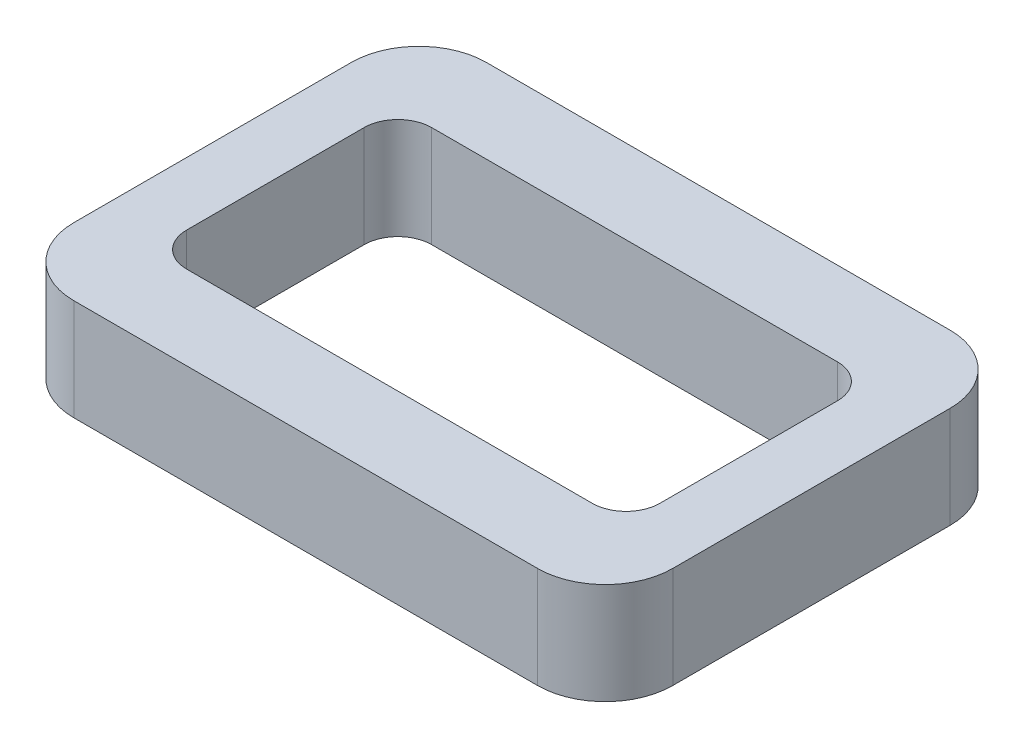
ISO-10303-21;
HEADER;
FILE_DESCRIPTION(('STEP AP214'),'2;1');
FILE_NAME('part.step','',(''),(''),'','','');
FILE_SCHEMA(('AUTOMOTIVE_DESIGN { 1 0 10303 214 1 1 1 1 }'));
ENDSEC;
DATA;
#1=APPLICATION_CONTEXT('core data for automotive mechanical design processes');
#2=APPLICATION_PROTOCOL_DEFINITION('international standard','automotive_design',2000,#1);
#3=PRODUCT_CONTEXT('',#1,'mechanical');
#4=PRODUCT('Part','Part','',(#3));
#5=PRODUCT_RELATED_PRODUCT_CATEGORY('part','',(#4));
#6=PRODUCT_DEFINITION_FORMATION('','',#4);
#7=PRODUCT_DEFINITION_CONTEXT('part definition',#1,'design');
#8=PRODUCT_DEFINITION('design','',#6,#7);
#9=PRODUCT_DEFINITION_SHAPE('','',#8);
#10=(LENGTH_UNIT() NAMED_UNIT(*) SI_UNIT(.MILLI.,.METRE.));
#11=(NAMED_UNIT(*) PLANE_ANGLE_UNIT() SI_UNIT($,.RADIAN.));
#12=(NAMED_UNIT(*) SI_UNIT($,.STERADIAN.) SOLID_ANGLE_UNIT());
#13=UNCERTAINTY_MEASURE_WITH_UNIT(LENGTH_MEASURE(1.E-05),#10,'distance_accuracy_value','');
#14=(GEOMETRIC_REPRESENTATION_CONTEXT(3) GLOBAL_UNCERTAINTY_ASSIGNED_CONTEXT((#13)) GLOBAL_UNIT_ASSIGNED_CONTEXT((#10,
#11,#12)) REPRESENTATION_CONTEXT('',''));
#15=CARTESIAN_POINT('',(0.,0.,0.));
#16=DIRECTION('',(0.,0.,1.));
#17=DIRECTION('',(1.,0.,0.));
#18=AXIS2_PLACEMENT_3D('',#15,#16,#17);
#19=CARTESIAN_POINT('',(81.8747524998957,15.24,21.3119442239792));
#20=DIRECTION('',(0.,-1.,0.));
#21=DIRECTION('',(0.,0.,-1.));
#22=AXIS2_PLACEMENT_3D('',#19,#20,#21);
#23=PLANE('',#22);
#24=DIRECTION('',(0.,0.,1.));
#25=VECTOR('',#24,1.);
#26=CARTESIAN_POINT('',(92.0347524998957,15.24,-20.3680557760208));
#27=LINE('',#26,#25);
#28=CARTESIAN_POINT('',(92.0347524998957,15.24,-20.3680557760208));
#29=VERTEX_POINT('',#28);
#30=CARTESIAN_POINT('',(92.0347524998957,15.24,21.3119442239792));
#31=VERTEX_POINT('',#30);
#32=EDGE_CURVE('E268',#29,#31,#27,.T.);
#33=ORIENTED_EDGE('',*,*,#32,.F.);
#34=CARTESIAN_POINT('',(81.8747524998957,15.24,-20.3680557760208));
#35=DIRECTION('',(0.,1.,0.));
#36=DIRECTION('',(0.,0.,1.));
#37=AXIS2_PLACEMENT_3D('',#34,#35,#36);
#38=CIRCLE('',#37,10.16);
#39=CARTESIAN_POINT('',(81.8747524998957,15.24,-30.5280557760208));
#40=VERTEX_POINT('',#39);
#41=EDGE_CURVE('E288',#29,#40,#38,.T.);
#42=ORIENTED_EDGE('',*,*,#41,.T.);
#43=DIRECTION('',(-1.,0.,0.));
#44=VECTOR('',#43,1.);
#45=CARTESIAN_POINT('',(81.8747524998957,15.24,-30.5280557760208));
#46=LINE('',#45,#44);
#47=CARTESIAN_POINT('',(12.1947524998957,15.24,-30.5280557760207));
#48=VERTEX_POINT('',#47);
#49=EDGE_CURVE('E286',#40,#48,#46,.T.);
#50=ORIENTED_EDGE('',*,*,#49,.T.);
#51=CARTESIAN_POINT('',(12.1947524998957,15.24,-20.3680557760207));
#52=DIRECTION('',(0.,-1.,0.));
#53=DIRECTION('',(0.,0.,-1.));
#54=AXIS2_PLACEMENT_3D('',#51,#52,#53);
#55=CIRCLE('',#54,10.16);
#56=CARTESIAN_POINT('',(2.03475249989574,15.24,-20.3680557760207));
#57=VERTEX_POINT('',#56);
#58=EDGE_CURVE('E283',#57,#48,#55,.T.);
#59=ORIENTED_EDGE('',*,*,#58,.F.);
#60=DIRECTION('',(0.,0.,1.));
#61=VECTOR('',#60,1.);
#62=CARTESIAN_POINT('',(2.03475249989574,15.24,-20.3680557760207));
#63=LINE('',#62,#61);
#64=CARTESIAN_POINT('',(2.03475249989575,15.24,21.3119442239793));
#65=VERTEX_POINT('',#64);
#66=EDGE_CURVE('E281',#57,#65,#63,.T.);
#67=ORIENTED_EDGE('',*,*,#66,.T.);
#68=CARTESIAN_POINT('',(12.1947524998957,15.24,21.3119442239793));
#69=DIRECTION('',(0.,-1.,0.));
#70=DIRECTION('',(0.,0.,-1.));
#71=AXIS2_PLACEMENT_3D('',#68,#69,#70);
#72=CIRCLE('',#71,10.16);
#73=CARTESIAN_POINT('',(12.1947524998957,15.24,31.4719442239793));
#74=VERTEX_POINT('',#73);
#75=EDGE_CURVE('E278',#74,#65,#72,.T.);
#76=ORIENTED_EDGE('',*,*,#75,.F.);
#77=DIRECTION('',(-1.,0.,0.));
#78=VECTOR('',#77,1.);
#79=CARTESIAN_POINT('',(81.8747524998957,15.24,31.4719442239792));
#80=LINE('',#79,#78);
#81=CARTESIAN_POINT('',(81.8747524998957,15.24,31.4719442239792));
#82=VERTEX_POINT('',#81);
#83=EDGE_CURVE('E275',#82,#74,#80,.T.);
#84=ORIENTED_EDGE('',*,*,#83,.F.);
#85=CARTESIAN_POINT('',(81.8747524998957,15.24,21.3119442239792));
#86=DIRECTION('',(0.,-1.,0.));
#87=DIRECTION('',(0.,0.,-1.));
#88=AXIS2_PLACEMENT_3D('',#85,#86,#87);
#89=CIRCLE('',#88,10.16);
#90=EDGE_CURVE('E271',#31,#82,#89,.T.);
#91=ORIENTED_EDGE('',*,*,#90,.F.);
#92=EDGE_LOOP('',(#33,#42,#50,#59,#67,#76,#84,#91));
#93=FACE_BOUND('',#92,.T.);
#94=DIRECTION('',(0.,0.,1.));
#95=VECTOR('',#94,1.);
#96=CARTESIAN_POINT('',(11.4747524998958,15.24,-12.8630557760207));
#97=LINE('',#96,#95);
#98=CARTESIAN_POINT('',(11.4747524998958,15.24,-12.8630557760207));
#99=VERTEX_POINT('',#98);
#100=CARTESIAN_POINT('',(11.4747524998958,15.24,13.8069442239792));
#101=VERTEX_POINT('',#100);
#102=EDGE_CURVE('E199',#99,#101,#97,.T.);
#103=ORIENTED_EDGE('',*,*,#102,.F.);
#104=CARTESIAN_POINT('',(16.5547524998958,15.24,-12.8630557760208));
#105=DIRECTION('',(0.,-1.,0.));
#106=DIRECTION('',(0.,0.,-1.));
#107=AXIS2_PLACEMENT_3D('',#104,#105,#106);
#108=CIRCLE('',#107,5.08);
#109=CARTESIAN_POINT('',(16.5547524998958,15.24,-17.9430557760208));
#110=VERTEX_POINT('',#109);
#111=EDGE_CURVE('E235',#99,#110,#108,.T.);
#112=ORIENTED_EDGE('',*,*,#111,.T.);
#113=DIRECTION('',(1.,0.,0.));
#114=VECTOR('',#113,1.);
#115=CARTESIAN_POINT('',(16.5547524998958,15.24,-17.9430557760208));
#116=LINE('',#115,#114);
#117=CARTESIAN_POINT('',(77.5147524998957,15.24,-17.9430557760208));
#118=VERTEX_POINT('',#117);
#119=EDGE_CURVE('E104',#110,#118,#116,.T.);
#120=ORIENTED_EDGE('',*,*,#119,.T.);
#121=CARTESIAN_POINT('',(77.5147524998957,15.24,-12.8630557760208));
#122=DIRECTION('',(0.,-1.,0.));
#123=DIRECTION('',(0.,0.,-1.));
#124=AXIS2_PLACEMENT_3D('',#121,#122,#123);
#125=CIRCLE('',#124,5.08);
#126=CARTESIAN_POINT('',(82.5947524998957,15.24,-12.8630557760207));
#127=VERTEX_POINT('',#126);
#128=EDGE_CURVE('E231',#118,#127,#125,.T.);
#129=ORIENTED_EDGE('',*,*,#128,.T.);
#130=DIRECTION('',(0.,0.,1.));
#131=VECTOR('',#130,1.);
#132=CARTESIAN_POINT('',(82.5947524998957,15.24,-12.8630557760207));
#133=LINE('',#132,#131);
#134=CARTESIAN_POINT('',(82.5947524998958,15.24,13.8069442239792));
#135=VERTEX_POINT('',#134);
#136=EDGE_CURVE('E228',#127,#135,#133,.T.);
#137=ORIENTED_EDGE('',*,*,#136,.T.);
#138=CARTESIAN_POINT('',(77.5147524998957,15.24,13.8069442239792));
#139=DIRECTION('',(0.,-1.,0.));
#140=DIRECTION('',(0.,0.,-1.));
#141=AXIS2_PLACEMENT_3D('',#138,#139,#140);
#142=CIRCLE('',#141,5.08);
#143=CARTESIAN_POINT('',(77.5147524998957,15.24,18.8869442239792));
#144=VERTEX_POINT('',#143);
#145=EDGE_CURVE('E224',#135,#144,#142,.T.);
#146=ORIENTED_EDGE('',*,*,#145,.T.);
#147=DIRECTION('',(1.,0.,0.));
#148=VECTOR('',#147,1.);
#149=CARTESIAN_POINT('',(16.5547524998958,15.24,18.8869442239792));
#150=LINE('',#149,#148);
#151=CARTESIAN_POINT('',(16.5547524998958,15.24,18.8869442239792));
#152=VERTEX_POINT('',#151);
#153=EDGE_CURVE('E222',#152,#144,#150,.T.);
#154=ORIENTED_EDGE('',*,*,#153,.F.);
#155=CARTESIAN_POINT('',(16.5547524998958,15.24,13.8069442239792));
#156=DIRECTION('',(0.,-1.,0.));
#157=DIRECTION('',(0.,0.,-1.));
#158=AXIS2_PLACEMENT_3D('',#155,#156,#157);
#159=CIRCLE('',#158,5.08);
#160=EDGE_CURVE('E209',#152,#101,#159,.T.);
#161=ORIENTED_EDGE('',*,*,#160,.T.);
#162=EDGE_LOOP('',(#103,#112,#120,#129,#137,#146,#154,#161));
#163=FACE_BOUND('',#162,.T.);
#164=ADVANCED_FACE('F87',(#93,#163),#23,.F.);
#165=CARTESIAN_POINT('',(81.8747524998957,0.,21.3119442239792));
#166=DIRECTION('',(0.,-1.,0.));
#167=DIRECTION('',(0.,0.,-1.));
#168=AXIS2_PLACEMENT_3D('',#165,#166,#167);
#169=PLANE('',#168);
#170=DIRECTION('',(0.,0.,1.));
#171=VECTOR('',#170,1.);
#172=CARTESIAN_POINT('',(92.0347524998957,0.,-20.3680557760208));
#173=LINE('',#172,#171);
#174=CARTESIAN_POINT('',(92.0347524998957,0.,-20.3680557760208));
#175=VERTEX_POINT('',#174);
#176=CARTESIAN_POINT('',(92.0347524998957,0.,21.3119442239792));
#177=VERTEX_POINT('',#176);
#178=EDGE_CURVE('E218',#175,#177,#173,.T.);
#179=ORIENTED_EDGE('',*,*,#178,.T.);
#180=CARTESIAN_POINT('',(81.8747524998957,0.,21.3119442239792));
#181=DIRECTION('',(0.,-1.,0.));
#182=DIRECTION('',(0.,0.,-1.));
#183=AXIS2_PLACEMENT_3D('',#180,#181,#182);
#184=CIRCLE('',#183,10.16);
#185=CARTESIAN_POINT('',(81.8747524998957,0.,31.4719442239792));
#186=VERTEX_POINT('',#185);
#187=EDGE_CURVE('E292',#177,#186,#184,.T.);
#188=ORIENTED_EDGE('',*,*,#187,.T.);
#189=DIRECTION('',(-1.,0.,0.));
#190=VECTOR('',#189,1.);
#191=CARTESIAN_POINT('',(81.8747524998957,0.,31.4719442239792));
#192=LINE('',#191,#190);
#193=CARTESIAN_POINT('',(12.1947524998957,0.,31.4719442239793));
#194=VERTEX_POINT('',#193);
#195=EDGE_CURVE('E295',#186,#194,#192,.T.);
#196=ORIENTED_EDGE('',*,*,#195,.T.);
#197=CARTESIAN_POINT('',(12.1947524998957,0.,21.3119442239793));
#198=DIRECTION('',(0.,-1.,0.));
#199=DIRECTION('',(0.,0.,-1.));
#200=AXIS2_PLACEMENT_3D('',#197,#198,#199);
#201=CIRCLE('',#200,10.16);
#202=CARTESIAN_POINT('',(2.03475249989575,0.,21.3119442239793));
#203=VERTEX_POINT('',#202);
#204=EDGE_CURVE('E298',#194,#203,#201,.T.);
#205=ORIENTED_EDGE('',*,*,#204,.T.);
#206=DIRECTION('',(0.,0.,1.));
#207=VECTOR('',#206,1.);
#208=CARTESIAN_POINT('',(2.03475249989574,0.,-20.3680557760207));
#209=LINE('',#208,#207);
#210=CARTESIAN_POINT('',(2.03475249989574,0.,-20.3680557760207));
#211=VERTEX_POINT('',#210);
#212=EDGE_CURVE('E301',#211,#203,#209,.T.);
#213=ORIENTED_EDGE('',*,*,#212,.F.);
#214=CARTESIAN_POINT('',(12.1947524998957,0.,-20.3680557760207));
#215=DIRECTION('',(0.,-1.,0.));
#216=DIRECTION('',(0.,0.,-1.));
#217=AXIS2_PLACEMENT_3D('',#214,#215,#216);
#218=CIRCLE('',#217,10.16);
#219=CARTESIAN_POINT('',(12.1947524998957,0.,-30.5280557760207));
#220=VERTEX_POINT('',#219);
#221=EDGE_CURVE('E304',#211,#220,#218,.T.);
#222=ORIENTED_EDGE('',*,*,#221,.T.);
#223=DIRECTION('',(-1.,0.,0.));
#224=VECTOR('',#223,1.);
#225=CARTESIAN_POINT('',(81.8747524998957,0.,-30.5280557760208));
#226=LINE('',#225,#224);
#227=CARTESIAN_POINT('',(81.8747524998957,0.,-30.5280557760208));
#228=VERTEX_POINT('',#227);
#229=EDGE_CURVE('E307',#228,#220,#226,.T.);
#230=ORIENTED_EDGE('',*,*,#229,.F.);
#231=CARTESIAN_POINT('',(81.8747524998957,0.,-20.3680557760208));
#232=DIRECTION('',(0.,1.,0.));
#233=DIRECTION('',(0.,0.,1.));
#234=AXIS2_PLACEMENT_3D('',#231,#232,#233);
#235=CIRCLE('',#234,10.16);
#236=EDGE_CURVE('E272',#175,#228,#235,.T.);
#237=ORIENTED_EDGE('',*,*,#236,.F.);
#238=EDGE_LOOP('',(#179,#188,#196,#205,#213,#222,#230,#237));
#239=FACE_BOUND('',#238,.T.);
#240=CARTESIAN_POINT('',(16.5547524998958,0.,-12.8630557760208));
#241=DIRECTION('',(0.,-1.,0.));
#242=DIRECTION('',(0.,0.,-1.));
#243=AXIS2_PLACEMENT_3D('',#240,#241,#242);
#244=CIRCLE('',#243,5.08);
#245=CARTESIAN_POINT('',(11.4747524998958,0.,-12.8630557760207));
#246=VERTEX_POINT('',#245);
#247=CARTESIAN_POINT('',(16.5547524998958,0.,-17.9430557760208));
#248=VERTEX_POINT('',#247);
#249=EDGE_CURVE('E210',#246,#248,#244,.T.);
#250=ORIENTED_EDGE('',*,*,#249,.F.);
#251=DIRECTION('',(0.,0.,1.));
#252=VECTOR('',#251,1.);
#253=CARTESIAN_POINT('',(11.4747524998958,0.,-12.8630557760207));
#254=LINE('',#253,#252);
#255=CARTESIAN_POINT('',(11.4747524998958,0.,13.8069442239792));
#256=VERTEX_POINT('',#255);
#257=EDGE_CURVE('E112',#246,#256,#254,.T.);
#258=ORIENTED_EDGE('',*,*,#257,.T.);
#259=CARTESIAN_POINT('',(16.5547524998958,0.,13.8069442239792));
#260=DIRECTION('',(0.,-1.,0.));
#261=DIRECTION('',(0.,0.,-1.));
#262=AXIS2_PLACEMENT_3D('',#259,#260,#261);
#263=CIRCLE('',#262,5.08);
#264=CARTESIAN_POINT('',(16.5547524998958,0.,18.8869442239792));
#265=VERTEX_POINT('',#264);
#266=EDGE_CURVE('E217',#265,#256,#263,.T.);
#267=ORIENTED_EDGE('',*,*,#266,.F.);
#268=DIRECTION('',(1.,0.,0.));
#269=VECTOR('',#268,1.);
#270=CARTESIAN_POINT('',(16.5547524998958,0.,18.8869442239792));
#271=LINE('',#270,#269);
#272=CARTESIAN_POINT('',(77.5147524998957,0.,18.8869442239792));
#273=VERTEX_POINT('',#272);
#274=EDGE_CURVE('E239',#265,#273,#271,.T.);
#275=ORIENTED_EDGE('',*,*,#274,.T.);
#276=CARTESIAN_POINT('',(77.5147524998957,0.,13.8069442239792));
#277=DIRECTION('',(0.,-1.,0.));
#278=DIRECTION('',(0.,0.,-1.));
#279=AXIS2_PLACEMENT_3D('',#276,#277,#278);
#280=CIRCLE('',#279,5.08);
#281=CARTESIAN_POINT('',(82.5947524998958,0.,13.8069442239792));
#282=VERTEX_POINT('',#281);
#283=EDGE_CURVE('E242',#282,#273,#280,.T.);
#284=ORIENTED_EDGE('',*,*,#283,.F.);
#285=DIRECTION('',(0.,0.,1.));
#286=VECTOR('',#285,1.);
#287=CARTESIAN_POINT('',(82.5947524998957,0.,-12.8630557760207));
#288=LINE('',#287,#286);
#289=CARTESIAN_POINT('',(82.5947524998957,0.,-12.8630557760207));
#290=VERTEX_POINT('',#289);
#291=EDGE_CURVE('E245',#290,#282,#288,.T.);
#292=ORIENTED_EDGE('',*,*,#291,.F.);
#293=CARTESIAN_POINT('',(77.5147524998957,0.,-12.8630557760208));
#294=DIRECTION('',(0.,-1.,0.));
#295=DIRECTION('',(0.,0.,-1.));
#296=AXIS2_PLACEMENT_3D('',#293,#294,#295);
#297=CIRCLE('',#296,5.08);
#298=CARTESIAN_POINT('',(77.5147524998957,0.,-17.9430557760208));
#299=VERTEX_POINT('',#298);
#300=EDGE_CURVE('E248',#299,#290,#297,.T.);
#301=ORIENTED_EDGE('',*,*,#300,.F.);
#302=DIRECTION('',(1.,0.,0.));
#303=VECTOR('',#302,1.);
#304=CARTESIAN_POINT('',(16.5547524998958,0.,-17.9430557760208));
#305=LINE('',#304,#303);
#306=EDGE_CURVE('E251',#248,#299,#305,.T.);
#307=ORIENTED_EDGE('',*,*,#306,.F.);
#308=EDGE_LOOP('',(#250,#258,#267,#275,#284,#292,#301,#307));
#309=FACE_BOUND('',#308,.T.);
#310=ADVANCED_FACE('F331',(#239,#309),#169,.T.);
#311=CARTESIAN_POINT('',(92.0347524998957,15.24,-20.3680557760208));
#312=DIRECTION('',(1.,0.,0.));
#313=DIRECTION('',(0.,0.,-1.));
#314=AXIS2_PLACEMENT_3D('',#311,#312,#313);
#315=PLANE('',#314);
#316=ORIENTED_EDGE('',*,*,#178,.F.);
#317=DIRECTION('',(0.,-1.,0.));
#318=VECTOR('',#317,1.);
#319=CARTESIAN_POINT('',(92.0347524998957,15.24,-20.3680557760208));
#320=LINE('',#319,#318);
#321=EDGE_CURVE('E12',#29,#175,#320,.T.);
#322=ORIENTED_EDGE('',*,*,#321,.F.);
#323=ORIENTED_EDGE('',*,*,#32,.T.);
#324=DIRECTION('',(0.,-1.,0.));
#325=VECTOR('',#324,1.);
#326=CARTESIAN_POINT('',(92.0347524998957,15.24,21.3119442239792));
#327=LINE('',#326,#325);
#328=EDGE_CURVE('E91',#31,#177,#327,.T.);
#329=ORIENTED_EDGE('',*,*,#328,.T.);
#330=EDGE_LOOP('',(#316,#322,#323,#329));
#331=FACE_BOUND('',#330,.T.);
#332=ADVANCED_FACE('F89',(#331),#315,.T.);
#333=CARTESIAN_POINT('',(81.8747524998957,15.24,-20.3680557760208));
#334=DIRECTION('',(0.,-1.,0.));
#335=DIRECTION('',(0.,0.,-1.));
#336=AXIS2_PLACEMENT_3D('',#333,#334,#335);
#337=CYLINDRICAL_SURFACE('',#336,10.16);
#338=ORIENTED_EDGE('',*,*,#236,.T.);
#339=DIRECTION('',(0.,-1.,0.));
#340=VECTOR('',#339,1.);
#341=CARTESIAN_POINT('',(81.8747524998957,15.24,-30.5280557760208));
#342=LINE('',#341,#340);
#343=EDGE_CURVE('E96',#40,#228,#342,.T.);
#344=ORIENTED_EDGE('',*,*,#343,.F.);
#345=ORIENTED_EDGE('',*,*,#41,.F.);
#346=ORIENTED_EDGE('',*,*,#321,.T.);
#347=EDGE_LOOP('',(#338,#344,#345,#346));
#348=FACE_BOUND('',#347,.T.);
#349=ADVANCED_FACE('F336',(#348),#337,.T.);
#350=CARTESIAN_POINT('',(81.8747524998957,15.24,-30.5280557760208));
#351=DIRECTION('',(0.,0.,1.));
#352=DIRECTION('',(1.,0.,0.));
#353=AXIS2_PLACEMENT_3D('',#350,#351,#352);
#354=PLANE('',#353);
#355=ORIENTED_EDGE('',*,*,#229,.T.);
#356=DIRECTION('',(0.,-1.,0.));
#357=VECTOR('',#356,1.);
#358=CARTESIAN_POINT('',(12.1947524998957,15.24,-30.5280557760207));
#359=LINE('',#358,#357);
#360=EDGE_CURVE('E313',#48,#220,#359,.T.);
#361=ORIENTED_EDGE('',*,*,#360,.F.);
#362=ORIENTED_EDGE('',*,*,#49,.F.);
#363=ORIENTED_EDGE('',*,*,#343,.T.);
#364=EDGE_LOOP('',(#355,#361,#362,#363));
#365=FACE_BOUND('',#364,.T.);
#366=ADVANCED_FACE('F340',(#365),#354,.F.);
#367=CARTESIAN_POINT('',(12.1947524998957,15.24,-20.3680557760207));
#368=DIRECTION('',(0.,-1.,0.));
#369=DIRECTION('',(0.,0.,-1.));
#370=AXIS2_PLACEMENT_3D('',#367,#368,#369);
#371=CYLINDRICAL_SURFACE('',#370,10.16);
#372=ORIENTED_EDGE('',*,*,#221,.F.);
#373=DIRECTION('',(0.,-1.,0.));
#374=VECTOR('',#373,1.);
#375=CARTESIAN_POINT('',(2.03475249989574,15.24,-20.3680557760207));
#376=LINE('',#375,#374);
#377=EDGE_CURVE('E315',#57,#211,#376,.T.);
#378=ORIENTED_EDGE('',*,*,#377,.F.);
#379=ORIENTED_EDGE('',*,*,#58,.T.);
#380=ORIENTED_EDGE('',*,*,#360,.T.);
#381=EDGE_LOOP('',(#372,#378,#379,#380));
#382=FACE_BOUND('',#381,.T.);
#383=ADVANCED_FACE('F358',(#382),#371,.T.);
#384=CARTESIAN_POINT('',(2.03475249989574,15.24,-20.3680557760207));
#385=DIRECTION('',(1.,0.,0.));
#386=DIRECTION('',(0.,0.,-1.));
#387=AXIS2_PLACEMENT_3D('',#384,#385,#386);
#388=PLANE('',#387);
#389=ORIENTED_EDGE('',*,*,#212,.T.);
#390=DIRECTION('',(0.,-1.,0.));
#391=VECTOR('',#390,1.);
#392=CARTESIAN_POINT('',(2.03475249989575,15.24,21.3119442239793));
#393=LINE('',#392,#391);
#394=EDGE_CURVE('E317',#65,#203,#393,.T.);
#395=ORIENTED_EDGE('',*,*,#394,.F.);
#396=ORIENTED_EDGE('',*,*,#66,.F.);
#397=ORIENTED_EDGE('',*,*,#377,.T.);
#398=EDGE_LOOP('',(#389,#395,#396,#397));
#399=FACE_BOUND('',#398,.T.);
#400=ADVANCED_FACE('F356',(#399),#388,.F.);
#401=CARTESIAN_POINT('',(12.1947524998957,15.24,21.3119442239793));
#402=DIRECTION('',(0.,-1.,0.));
#403=DIRECTION('',(0.,0.,-1.));
#404=AXIS2_PLACEMENT_3D('',#401,#402,#403);
#405=CYLINDRICAL_SURFACE('',#404,10.16);
#406=ORIENTED_EDGE('',*,*,#204,.F.);
#407=DIRECTION('',(0.,-1.,0.));
#408=VECTOR('',#407,1.);
#409=CARTESIAN_POINT('',(12.1947524998957,15.24,31.4719442239793));
#410=LINE('',#409,#408);
#411=EDGE_CURVE('E319',#74,#194,#410,.T.);
#412=ORIENTED_EDGE('',*,*,#411,.F.);
#413=ORIENTED_EDGE('',*,*,#75,.T.);
#414=ORIENTED_EDGE('',*,*,#394,.T.);
#415=EDGE_LOOP('',(#406,#412,#413,#414));
#416=FACE_BOUND('',#415,.T.);
#417=ADVANCED_FACE('F352',(#416),#405,.T.);
#418=CARTESIAN_POINT('',(81.8747524998957,15.24,31.4719442239792));
#419=DIRECTION('',(0.,0.,1.));
#420=DIRECTION('',(1.,0.,0.));
#421=AXIS2_PLACEMENT_3D('',#418,#419,#420);
#422=PLANE('',#421);
#423=ORIENTED_EDGE('',*,*,#195,.F.);
#424=DIRECTION('',(0.,-1.,0.));
#425=VECTOR('',#424,1.);
#426=CARTESIAN_POINT('',(81.8747524998957,15.24,31.4719442239792));
#427=LINE('',#426,#425);
#428=EDGE_CURVE('E320',#82,#186,#427,.T.);
#429=ORIENTED_EDGE('',*,*,#428,.F.);
#430=ORIENTED_EDGE('',*,*,#83,.T.);
#431=ORIENTED_EDGE('',*,*,#411,.T.);
#432=EDGE_LOOP('',(#423,#429,#430,#431));
#433=FACE_BOUND('',#432,.T.);
#434=ADVANCED_FACE('F347',(#433),#422,.T.);
#435=CARTESIAN_POINT('',(81.8747524998957,15.24,21.3119442239792));
#436=DIRECTION('',(0.,-1.,0.));
#437=DIRECTION('',(0.,0.,-1.));
#438=AXIS2_PLACEMENT_3D('',#435,#436,#437);
#439=CYLINDRICAL_SURFACE('',#438,10.16);
#440=ORIENTED_EDGE('',*,*,#187,.F.);
#441=ORIENTED_EDGE('',*,*,#328,.F.);
#442=ORIENTED_EDGE('',*,*,#90,.T.);
#443=ORIENTED_EDGE('',*,*,#428,.T.);
#444=EDGE_LOOP('',(#440,#441,#442,#443));
#445=FACE_BOUND('',#444,.T.);
#446=ADVANCED_FACE('F328',(#445),#439,.T.);
#447=CARTESIAN_POINT('',(11.4747524998958,15.24,-12.8630557760207));
#448=DIRECTION('',(1.,0.,0.));
#449=DIRECTION('',(0.,0.,-1.));
#450=AXIS2_PLACEMENT_3D('',#447,#448,#449);
#451=PLANE('',#450);
#452=ORIENTED_EDGE('',*,*,#257,.F.);
#453=DIRECTION('',(0.,-1.,0.));
#454=VECTOR('',#453,1.);
#455=CARTESIAN_POINT('',(11.4747524998958,15.24,-12.8630557760207));
#456=LINE('',#455,#454);
#457=EDGE_CURVE('E204',#99,#246,#456,.T.);
#458=ORIENTED_EDGE('',*,*,#457,.F.);
#459=ORIENTED_EDGE('',*,*,#102,.T.);
#460=DIRECTION('',(0.,-1.,0.));
#461=VECTOR('',#460,1.);
#462=CARTESIAN_POINT('',(11.4747524998958,15.24,13.8069442239792));
#463=LINE('',#462,#461);
#464=EDGE_CURVE('E202',#101,#256,#463,.T.);
#465=ORIENTED_EDGE('',*,*,#464,.T.);
#466=EDGE_LOOP('',(#452,#458,#459,#465));
#467=FACE_BOUND('',#466,.T.);
#468=ADVANCED_FACE('F201',(#467),#451,.T.);
#469=CARTESIAN_POINT('',(16.5547524998958,15.24,13.8069442239792));
#470=DIRECTION('',(0.,-1.,0.));
#471=DIRECTION('',(0.,0.,-1.));
#472=AXIS2_PLACEMENT_3D('',#469,#470,#471);
#473=CYLINDRICAL_SURFACE('',#472,5.08);
#474=ORIENTED_EDGE('',*,*,#266,.T.);
#475=ORIENTED_EDGE('',*,*,#464,.F.);
#476=ORIENTED_EDGE('',*,*,#160,.F.);
#477=DIRECTION('',(0.,-1.,0.));
#478=VECTOR('',#477,1.);
#479=CARTESIAN_POINT('',(16.5547524998958,15.24,18.8869442239792));
#480=LINE('',#479,#478);
#481=EDGE_CURVE('E219',#152,#265,#480,.T.);
#482=ORIENTED_EDGE('',*,*,#481,.T.);
#483=EDGE_LOOP('',(#474,#475,#476,#482));
#484=FACE_BOUND('',#483,.T.);
#485=ADVANCED_FACE('F214',(#484),#473,.F.);
#486=CARTESIAN_POINT('',(16.5547524998958,15.24,18.8869442239792));
#487=DIRECTION('',(0.,0.,-1.));
#488=DIRECTION('',(-1.,0.,0.));
#489=AXIS2_PLACEMENT_3D('',#486,#487,#488);
#490=PLANE('',#489);
#491=ORIENTED_EDGE('',*,*,#274,.F.);
#492=ORIENTED_EDGE('',*,*,#481,.F.);
#493=ORIENTED_EDGE('',*,*,#153,.T.);
#494=DIRECTION('',(0.,-1.,0.));
#495=VECTOR('',#494,1.);
#496=CARTESIAN_POINT('',(77.5147524998957,15.24,18.8869442239792));
#497=LINE('',#496,#495);
#498=EDGE_CURVE('E265',#144,#273,#497,.T.);
#499=ORIENTED_EDGE('',*,*,#498,.T.);
#500=EDGE_LOOP('',(#491,#492,#493,#499));
#501=FACE_BOUND('',#500,.T.);
#502=ADVANCED_FACE('F446',(#501),#490,.T.);
#503=CARTESIAN_POINT('',(77.5147524998957,15.24,13.8069442239792));
#504=DIRECTION('',(0.,-1.,0.));
#505=DIRECTION('',(0.,0.,-1.));
#506=AXIS2_PLACEMENT_3D('',#503,#504,#505);
#507=CYLINDRICAL_SURFACE('',#506,5.08);
#508=ORIENTED_EDGE('',*,*,#283,.T.);
#509=ORIENTED_EDGE('',*,*,#498,.F.);
#510=ORIENTED_EDGE('',*,*,#145,.F.);
#511=DIRECTION('',(0.,-1.,0.));
#512=VECTOR('',#511,1.);
#513=CARTESIAN_POINT('',(82.5947524998958,15.24,13.8069442239792));
#514=LINE('',#513,#512);
#515=EDGE_CURVE('E263',#135,#282,#514,.T.);
#516=ORIENTED_EDGE('',*,*,#515,.T.);
#517=EDGE_LOOP('',(#508,#509,#510,#516));
#518=FACE_BOUND('',#517,.T.);
#519=ADVANCED_FACE('F453',(#518),#507,.F.);
#520=CARTESIAN_POINT('',(82.5947524998957,15.24,-12.8630557760207));
#521=DIRECTION('',(1.,0.,0.));
#522=DIRECTION('',(0.,0.,-1.));
#523=AXIS2_PLACEMENT_3D('',#520,#521,#522);
#524=PLANE('',#523);
#525=ORIENTED_EDGE('',*,*,#291,.T.);
#526=ORIENTED_EDGE('',*,*,#515,.F.);
#527=ORIENTED_EDGE('',*,*,#136,.F.);
#528=DIRECTION('',(0.,-1.,0.));
#529=VECTOR('',#528,1.);
#530=CARTESIAN_POINT('',(82.5947524998957,15.24,-12.8630557760207));
#531=LINE('',#530,#529);
#532=EDGE_CURVE('E261',#127,#290,#531,.T.);
#533=ORIENTED_EDGE('',*,*,#532,.T.);
#534=EDGE_LOOP('',(#525,#526,#527,#533));
#535=FACE_BOUND('',#534,.T.);
#536=ADVANCED_FACE('F462',(#535),#524,.F.);
#537=CARTESIAN_POINT('',(77.5147524998957,15.24,-12.8630557760208));
#538=DIRECTION('',(0.,-1.,0.));
#539=DIRECTION('',(0.,0.,-1.));
#540=AXIS2_PLACEMENT_3D('',#537,#538,#539);
#541=CYLINDRICAL_SURFACE('',#540,5.08);
#542=ORIENTED_EDGE('',*,*,#300,.T.);
#543=ORIENTED_EDGE('',*,*,#532,.F.);
#544=ORIENTED_EDGE('',*,*,#128,.F.);
#545=DIRECTION('',(0.,-1.,0.));
#546=VECTOR('',#545,1.);
#547=CARTESIAN_POINT('',(77.5147524998957,15.24,-17.9430557760208));
#548=LINE('',#547,#546);
#549=EDGE_CURVE('E259',#118,#299,#548,.T.);
#550=ORIENTED_EDGE('',*,*,#549,.T.);
#551=EDGE_LOOP('',(#542,#543,#544,#550));
#552=FACE_BOUND('',#551,.T.);
#553=ADVANCED_FACE('F471',(#552),#541,.F.);
#554=CARTESIAN_POINT('',(16.5547524998958,15.24,-17.9430557760208));
#555=DIRECTION('',(0.,0.,-1.));
#556=DIRECTION('',(-1.,0.,0.));
#557=AXIS2_PLACEMENT_3D('',#554,#555,#556);
#558=PLANE('',#557);
#559=ORIENTED_EDGE('',*,*,#306,.T.);
#560=ORIENTED_EDGE('',*,*,#549,.F.);
#561=ORIENTED_EDGE('',*,*,#119,.F.);
#562=DIRECTION('',(0.,-1.,0.));
#563=VECTOR('',#562,1.);
#564=CARTESIAN_POINT('',(16.5547524998958,15.24,-17.9430557760208));
#565=LINE('',#564,#563);
#566=EDGE_CURVE('E257',#110,#248,#565,.T.);
#567=ORIENTED_EDGE('',*,*,#566,.T.);
#568=EDGE_LOOP('',(#559,#560,#561,#567));
#569=FACE_BOUND('',#568,.T.);
#570=ADVANCED_FACE('F480',(#569),#558,.F.);
#571=CARTESIAN_POINT('',(16.5547524998958,15.24,-12.8630557760208));
#572=DIRECTION('',(0.,-1.,0.));
#573=DIRECTION('',(0.,0.,-1.));
#574=AXIS2_PLACEMENT_3D('',#571,#572,#573);
#575=CYLINDRICAL_SURFACE('',#574,5.08);
#576=ORIENTED_EDGE('',*,*,#249,.T.);
#577=ORIENTED_EDGE('',*,*,#566,.F.);
#578=ORIENTED_EDGE('',*,*,#111,.F.);
#579=ORIENTED_EDGE('',*,*,#457,.T.);
#580=EDGE_LOOP('',(#576,#577,#578,#579));
#581=FACE_BOUND('',#580,.T.);
#582=ADVANCED_FACE('F489',(#581),#575,.F.);
#583=CLOSED_SHELL('',(#164,#310,#332,#349,#366,#383,#400,#417,#434,#446,#468,#485,#502,#519,
#536,#553,#570,#582));
#584=MANIFOLD_SOLID_BREP('B2',#583);
#585=ADVANCED_BREP_SHAPE_REPRESENTATION('',(#18,#584),#14);
#586=SHAPE_DEFINITION_REPRESENTATION(#9,#585);
ENDSEC;
END-ISO-10303-21;
